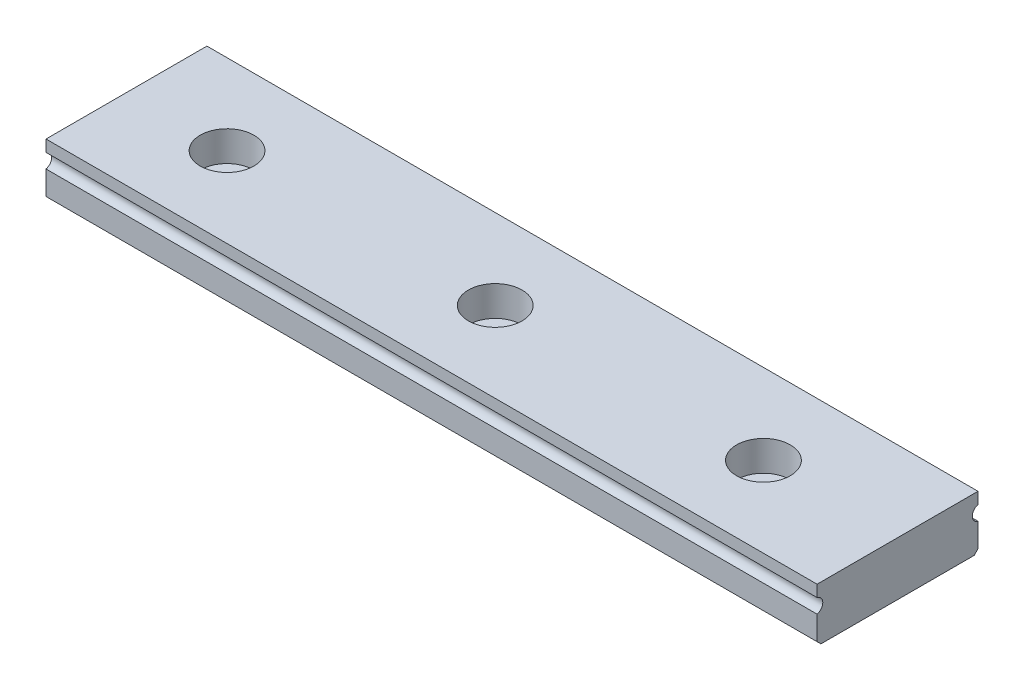
ISO-10303-21;
HEADER;
FILE_DESCRIPTION(('STEP AP214'),'2;1');
FILE_NAME('part.step','',(''),(''),'','','');
FILE_SCHEMA(('AUTOMOTIVE_DESIGN { 1 0 10303 214 1 1 1 1 }'));
ENDSEC;
DATA;
#1=APPLICATION_CONTEXT('core data for automotive mechanical design processes');
#2=APPLICATION_PROTOCOL_DEFINITION('international standard','automotive_design',2000,#1);
#3=PRODUCT_CONTEXT('',#1,'mechanical');
#4=PRODUCT('Part','Part','',(#3));
#5=PRODUCT_RELATED_PRODUCT_CATEGORY('part','',(#4));
#6=PRODUCT_DEFINITION_FORMATION('','',#4);
#7=PRODUCT_DEFINITION_CONTEXT('part definition',#1,'design');
#8=PRODUCT_DEFINITION('design','',#6,#7);
#9=PRODUCT_DEFINITION_SHAPE('','',#8);
#10=(LENGTH_UNIT() NAMED_UNIT(*) SI_UNIT(.MILLI.,.METRE.));
#11=(NAMED_UNIT(*) PLANE_ANGLE_UNIT() SI_UNIT($,.RADIAN.));
#12=(NAMED_UNIT(*) SI_UNIT($,.STERADIAN.) SOLID_ANGLE_UNIT());
#13=UNCERTAINTY_MEASURE_WITH_UNIT(LENGTH_MEASURE(1.E-05),#10,'distance_accuracy_value','');
#14=(GEOMETRIC_REPRESENTATION_CONTEXT(3) GLOBAL_UNCERTAINTY_ASSIGNED_CONTEXT((#13)) GLOBAL_UNIT_ASSIGNED_CONTEXT((#10,
#11,#12)) REPRESENTATION_CONTEXT('',''));
#15=CARTESIAN_POINT('',(0.,0.,0.));
#16=DIRECTION('',(0.,0.,1.));
#17=DIRECTION('',(1.,0.,0.));
#18=AXIS2_PLACEMENT_3D('',#15,#16,#17);
#19=CARTESIAN_POINT('',(0.,-3.,11.43));
#20=DIRECTION('',(0.,-0.707106781186547,0.707106781186548));
#21=DIRECTION('',(0.,-0.707106781186548,-0.707106781186547));
#22=AXIS2_PLACEMENT_3D('',#19,#20,#21);
#23=PLANE('',#22);
#24=DIRECTION('',(0.,-0.707106781186548,-0.707106781186547));
#25=VECTOR('',#24,1.);
#26=CARTESIAN_POINT('',(0.,-3.,11.43));
#27=LINE('',#26,#25);
#28=CARTESIAN_POINT('',(0.,-2.42999999999999,12.));
#29=VERTEX_POINT('',#28);
#30=CARTESIAN_POINT('',(0.,-3.,11.43));
#31=VERTEX_POINT('',#30);
#32=EDGE_CURVE('E186',#29,#31,#27,.T.);
#33=ORIENTED_EDGE('',*,*,#32,.T.);
#34=DIRECTION('',(1.,0.,0.));
#35=VECTOR('',#34,1.);
#36=CARTESIAN_POINT('',(0.,-3.,11.43));
#37=LINE('',#36,#35);
#38=CARTESIAN_POINT('',(115.,-3.,11.43));
#39=VERTEX_POINT('',#38);
#40=EDGE_CURVE('E176',#39,#31,#37,.F.);
#41=ORIENTED_EDGE('',*,*,#40,.F.);
#42=DIRECTION('',(0.,-0.707106781186548,-0.707106781186547));
#43=VECTOR('',#42,1.);
#44=CARTESIAN_POINT('',(115.,-3.,11.43));
#45=LINE('',#44,#43);
#46=CARTESIAN_POINT('',(115.,-2.42999999999999,12.));
#47=VERTEX_POINT('',#46);
#48=EDGE_CURVE('E193',#39,#47,#45,.F.);
#49=ORIENTED_EDGE('',*,*,#48,.T.);
#50=DIRECTION('',(1.,0.,0.));
#51=VECTOR('',#50,1.);
#52=CARTESIAN_POINT('',(0.,-2.43,12.));
#53=LINE('',#52,#51);
#54=EDGE_CURVE('E173',#29,#47,#53,.T.);
#55=ORIENTED_EDGE('',*,*,#54,.F.);
#56=EDGE_LOOP('',(#33,#41,#49,#55));
#57=FACE_BOUND('',#56,.T.);
#58=ADVANCED_FACE('F16',(#57),#23,.T.);
#59=CARTESIAN_POINT('',(0.,-2.43,-12.));
#60=DIRECTION('',(0.,-0.707106781186548,-0.707106781186547));
#61=DIRECTION('',(0.,0.707106781186547,-0.707106781186548));
#62=AXIS2_PLACEMENT_3D('',#59,#60,#61);
#63=PLANE('',#62);
#64=DIRECTION('',(0.,0.707106781186547,-0.707106781186548));
#65=VECTOR('',#64,1.);
#66=CARTESIAN_POINT('',(0.,-2.43,-12.));
#67=LINE('',#66,#65);
#68=CARTESIAN_POINT('',(0.,-3.,-11.43));
#69=VERTEX_POINT('',#68);
#70=CARTESIAN_POINT('',(0.,-2.43,-12.));
#71=VERTEX_POINT('',#70);
#72=EDGE_CURVE('E185',#69,#71,#67,.T.);
#73=ORIENTED_EDGE('',*,*,#72,.T.);
#74=DIRECTION('',(-1.,0.,0.));
#75=VECTOR('',#74,1.);
#76=CARTESIAN_POINT('',(0.,-2.43,-12.));
#77=LINE('',#76,#75);
#78=CARTESIAN_POINT('',(115.,-2.43,-12.));
#79=VERTEX_POINT('',#78);
#80=EDGE_CURVE('E110',#79,#71,#77,.T.);
#81=ORIENTED_EDGE('',*,*,#80,.F.);
#82=DIRECTION('',(0.,0.707106781186547,-0.707106781186548));
#83=VECTOR('',#82,1.);
#84=CARTESIAN_POINT('',(115.,-2.43,-12.));
#85=LINE('',#84,#83);
#86=CARTESIAN_POINT('',(115.,-3.,-11.43));
#87=VERTEX_POINT('',#86);
#88=EDGE_CURVE('E114',#79,#87,#85,.F.);
#89=ORIENTED_EDGE('',*,*,#88,.T.);
#90=DIRECTION('',(1.,0.,0.));
#91=VECTOR('',#90,1.);
#92=CARTESIAN_POINT('',(0.,-3.,-11.43));
#93=LINE('',#92,#91);
#94=EDGE_CURVE('E199',#69,#87,#93,.T.);
#95=ORIENTED_EDGE('',*,*,#94,.F.);
#96=EDGE_LOOP('',(#73,#81,#89,#95));
#97=FACE_BOUND('',#96,.T.);
#98=ADVANCED_FACE('F252',(#97),#63,.T.);
#99=CARTESIAN_POINT('',(15.,-1.25,0.));
#100=DIRECTION('',(0.,-1.,0.));
#101=DIRECTION('',(0.,0.,-1.));
#102=AXIS2_PLACEMENT_3D('',#99,#100,#101);
#103=CYLINDRICAL_SURFACE('',#102,2.25);
#104=CARTESIAN_POINT('',(15.,-3.,0.));
#105=DIRECTION('',(0.,-1.,0.));
#106=DIRECTION('',(0.,0.,-1.));
#107=AXIS2_PLACEMENT_3D('',#104,#105,#106);
#108=CIRCLE('',#107,2.25);
#109=CARTESIAN_POINT('',(15.,-3.,-2.25));
#110=VERTEX_POINT('',#109);
#111=EDGE_CURVE('E202',#110,#110,#108,.F.);
#112=ORIENTED_EDGE('',*,*,#111,.F.);
#113=EDGE_LOOP('',(#112));
#114=FACE_BOUND('',#113,.T.);
#115=CARTESIAN_POINT('',(15.,0.5,0.));
#116=DIRECTION('',(0.,-1.,0.));
#117=DIRECTION('',(0.,0.,-1.));
#118=AXIS2_PLACEMENT_3D('',#115,#116,#117);
#119=CIRCLE('',#118,2.25);
#120=CARTESIAN_POINT('',(15.,0.5,-2.25));
#121=VERTEX_POINT('',#120);
#122=EDGE_CURVE('E180',#121,#121,#119,.F.);
#123=ORIENTED_EDGE('',*,*,#122,.T.);
#124=EDGE_LOOP('',(#123));
#125=FACE_BOUND('',#124,.T.);
#126=ADVANCED_FACE('F248',(#114,#125),#103,.F.);
#127=CARTESIAN_POINT('',(95.,-1.25,0.));
#128=DIRECTION('',(0.,-1.,0.));
#129=DIRECTION('',(0.,0.,-1.));
#130=AXIS2_PLACEMENT_3D('',#127,#128,#129);
#131=CYLINDRICAL_SURFACE('',#130,2.25);
#132=CARTESIAN_POINT('',(95.,-3.,0.));
#133=DIRECTION('',(0.,-1.,0.));
#134=DIRECTION('',(0.,0.,-1.));
#135=AXIS2_PLACEMENT_3D('',#132,#133,#134);
#136=CIRCLE('',#135,2.25);
#137=CARTESIAN_POINT('',(95.,-3.,-2.25));
#138=VERTEX_POINT('',#137);
#139=EDGE_CURVE('E240',#138,#138,#136,.F.);
#140=ORIENTED_EDGE('',*,*,#139,.F.);
#141=EDGE_LOOP('',(#140));
#142=FACE_BOUND('',#141,.T.);
#143=CARTESIAN_POINT('',(95.,0.5,0.));
#144=DIRECTION('',(0.,-1.,0.));
#145=DIRECTION('',(0.,0.,-1.));
#146=AXIS2_PLACEMENT_3D('',#143,#144,#145);
#147=CIRCLE('',#146,2.25);
#148=CARTESIAN_POINT('',(95.,0.5,-2.25));
#149=VERTEX_POINT('',#148);
#150=EDGE_CURVE('E233',#149,#149,#147,.F.);
#151=ORIENTED_EDGE('',*,*,#150,.T.);
#152=EDGE_LOOP('',(#151));
#153=FACE_BOUND('',#152,.T.);
#154=ADVANCED_FACE('F251',(#142,#153),#131,.F.);
#155=CARTESIAN_POINT('',(55.,-1.25,0.));
#156=DIRECTION('',(0.,-1.,0.));
#157=DIRECTION('',(0.,0.,-1.));
#158=AXIS2_PLACEMENT_3D('',#155,#156,#157);
#159=CYLINDRICAL_SURFACE('',#158,2.25);
#160=CARTESIAN_POINT('',(55.,-3.,0.));
#161=DIRECTION('',(0.,-1.,0.));
#162=DIRECTION('',(0.,0.,-1.));
#163=AXIS2_PLACEMENT_3D('',#160,#161,#162);
#164=CIRCLE('',#163,2.25);
#165=CARTESIAN_POINT('',(55.,-3.,-2.25));
#166=VERTEX_POINT('',#165);
#167=EDGE_CURVE('E170',#166,#166,#164,.F.);
#168=ORIENTED_EDGE('',*,*,#167,.F.);
#169=EDGE_LOOP('',(#168));
#170=FACE_BOUND('',#169,.T.);
#171=CARTESIAN_POINT('',(55.,0.5,0.));
#172=DIRECTION('',(0.,-1.,0.));
#173=DIRECTION('',(0.,0.,-1.));
#174=AXIS2_PLACEMENT_3D('',#171,#172,#173);
#175=CIRCLE('',#174,2.25);
#176=CARTESIAN_POINT('',(55.,0.5,-2.25));
#177=VERTEX_POINT('',#176);
#178=EDGE_CURVE('E129',#177,#177,#175,.F.);
#179=ORIENTED_EDGE('',*,*,#178,.T.);
#180=EDGE_LOOP('',(#179));
#181=FACE_BOUND('',#180,.T.);
#182=ADVANCED_FACE('F313',(#170,#181),#159,.F.);
#183=CARTESIAN_POINT('',(0.,2.2,-12.25));
#184=DIRECTION('',(-1.,0.,0.));
#185=DIRECTION('',(0.,0.,1.));
#186=AXIS2_PLACEMENT_3D('',#183,#184,#185);
#187=CYLINDRICAL_SURFACE('',#186,1.1);
#188=CARTESIAN_POINT('',(115.,2.2,-12.25));
#189=DIRECTION('',(-1.,0.,0.));
#190=DIRECTION('',(0.,0.,1.));
#191=AXIS2_PLACEMENT_3D('',#188,#189,#190);
#192=CIRCLE('',#191,1.1);
#193=CARTESIAN_POINT('',(115.,3.27121426428143,-12.));
#194=VERTEX_POINT('',#193);
#195=CARTESIAN_POINT('',(115.,1.12878573571857,-12.));
#196=VERTEX_POINT('',#195);
#197=EDGE_CURVE('E90',#194,#196,#192,.F.);
#198=ORIENTED_EDGE('',*,*,#197,.T.);
#199=DIRECTION('',(-1.,0.,0.));
#200=VECTOR('',#199,1.);
#201=CARTESIAN_POINT('',(0.,1.12878573571857,-12.));
#202=LINE('',#201,#200);
#203=CARTESIAN_POINT('',(0.,1.12878573571857,-12.));
#204=VERTEX_POINT('',#203);
#205=EDGE_CURVE('E93',#204,#196,#202,.F.);
#206=ORIENTED_EDGE('',*,*,#205,.F.);
#207=CARTESIAN_POINT('',(0.,2.2,-12.25));
#208=DIRECTION('',(-1.,0.,0.));
#209=DIRECTION('',(0.,0.,1.));
#210=AXIS2_PLACEMENT_3D('',#207,#208,#209);
#211=CIRCLE('',#210,1.1);
#212=CARTESIAN_POINT('',(0.,3.27121426428143,-12.));
#213=VERTEX_POINT('',#212);
#214=EDGE_CURVE('E19',#213,#204,#211,.F.);
#215=ORIENTED_EDGE('',*,*,#214,.F.);
#216=DIRECTION('',(-1.,0.,0.));
#217=VECTOR('',#216,1.);
#218=CARTESIAN_POINT('',(0.,3.27121426428143,-12.));
#219=LINE('',#218,#217);
#220=EDGE_CURVE('E96',#194,#213,#219,.T.);
#221=ORIENTED_EDGE('',*,*,#220,.F.);
#222=EDGE_LOOP('',(#198,#206,#215,#221));
#223=FACE_BOUND('',#222,.T.);
#224=ADVANCED_FACE('F92',(#223),#187,.F.);
#225=CARTESIAN_POINT('',(0.,-2.43,12.));
#226=DIRECTION('',(0.,0.,1.));
#227=DIRECTION('',(1.,0.,0.));
#228=AXIS2_PLACEMENT_3D('',#225,#226,#227);
#229=PLANE('',#228);
#230=DIRECTION('',(0.,1.,0.));
#231=VECTOR('',#230,1.);
#232=CARTESIAN_POINT('',(0.,-3.,12.));
#233=LINE('',#232,#231);
#234=CARTESIAN_POINT('',(0.,1.12878573571857,12.));
#235=VERTEX_POINT('',#234);
#236=EDGE_CURVE('E208',#235,#29,#233,.F.);
#237=ORIENTED_EDGE('',*,*,#236,.T.);
#238=ORIENTED_EDGE('',*,*,#54,.T.);
#239=DIRECTION('',(0.,1.,0.));
#240=VECTOR('',#239,1.);
#241=CARTESIAN_POINT('',(115.,-3.00010307764064,12.0000000000001));
#242=LINE('',#241,#240);
#243=CARTESIAN_POINT('',(115.,1.12878573571856,12.0000000000001));
#244=VERTEX_POINT('',#243);
#245=EDGE_CURVE('E127',#47,#244,#242,.T.);
#246=ORIENTED_EDGE('',*,*,#245,.T.);
#247=DIRECTION('',(-1.,0.,0.));
#248=VECTOR('',#247,1.);
#249=CARTESIAN_POINT('',(0.,1.12878573571856,12.0000000000001));
#250=LINE('',#249,#248);
#251=EDGE_CURVE('E109',#244,#235,#250,.T.);
#252=ORIENTED_EDGE('',*,*,#251,.T.);
#253=EDGE_LOOP('',(#237,#238,#246,#252));
#254=FACE_BOUND('',#253,.T.);
#255=ADVANCED_FACE('F321',(#254),#229,.T.);
#256=CARTESIAN_POINT('',(0.,-3.,-11.43));
#257=DIRECTION('',(0.,-1.,0.));
#258=DIRECTION('',(0.,0.,-1.));
#259=AXIS2_PLACEMENT_3D('',#256,#257,#258);
#260=PLANE('',#259);
#261=ORIENTED_EDGE('',*,*,#167,.T.);
#262=EDGE_LOOP('',(#261));
#263=FACE_BOUND('',#262,.T.);
#264=ORIENTED_EDGE('',*,*,#139,.T.);
#265=EDGE_LOOP('',(#264));
#266=FACE_BOUND('',#265,.T.);
#267=ORIENTED_EDGE('',*,*,#111,.T.);
#268=EDGE_LOOP('',(#267));
#269=FACE_BOUND('',#268,.T.);
#270=DIRECTION('',(0.,0.,-1.));
#271=VECTOR('',#270,1.);
#272=CARTESIAN_POINT('',(0.,-3.,0.));
#273=LINE('',#272,#271);
#274=EDGE_CURVE('E205',#31,#69,#273,.T.);
#275=ORIENTED_EDGE('',*,*,#274,.T.);
#276=ORIENTED_EDGE('',*,*,#94,.T.);
#277=DIRECTION('',(0.,0.,1.));
#278=VECTOR('',#277,1.);
#279=CARTESIAN_POINT('',(115.,-3.,12.0000000000001));
#280=LINE('',#279,#278);
#281=EDGE_CURVE('E116',#87,#39,#280,.T.);
#282=ORIENTED_EDGE('',*,*,#281,.T.);
#283=ORIENTED_EDGE('',*,*,#40,.T.);
#284=EDGE_LOOP('',(#275,#276,#282,#283));
#285=FACE_BOUND('',#284,.T.);
#286=ADVANCED_FACE('F245',(#263,#266,#269,#285),#260,.T.);
#287=CARTESIAN_POINT('',(0.,1.12878573571857,-12.));
#288=DIRECTION('',(0.,0.,-1.));
#289=DIRECTION('',(-1.,0.,0.));
#290=AXIS2_PLACEMENT_3D('',#287,#288,#289);
#291=PLANE('',#290);
#292=DIRECTION('',(0.,1.,0.));
#293=VECTOR('',#292,1.);
#294=CARTESIAN_POINT('',(0.,-3.,-12.));
#295=LINE('',#294,#293);
#296=EDGE_CURVE('E108',#71,#204,#295,.T.);
#297=ORIENTED_EDGE('',*,*,#296,.T.);
#298=ORIENTED_EDGE('',*,*,#205,.T.);
#299=DIRECTION('',(0.,1.,0.));
#300=VECTOR('',#299,1.);
#301=CARTESIAN_POINT('',(115.,-3.00010307764064,-12.));
#302=LINE('',#301,#300);
#303=EDGE_CURVE('E100',#196,#79,#302,.F.);
#304=ORIENTED_EDGE('',*,*,#303,.T.);
#305=ORIENTED_EDGE('',*,*,#80,.T.);
#306=EDGE_LOOP('',(#297,#298,#304,#305));
#307=FACE_BOUND('',#306,.T.);
#308=ADVANCED_FACE('F105',(#307),#291,.T.);
#309=CARTESIAN_POINT('',(0.,2.2,12.25));
#310=DIRECTION('',(-1.,0.,0.));
#311=DIRECTION('',(0.,0.,1.));
#312=AXIS2_PLACEMENT_3D('',#309,#310,#311);
#313=CYLINDRICAL_SURFACE('',#312,1.1);
#314=CARTESIAN_POINT('',(115.,2.2,12.25));
#315=DIRECTION('',(-1.,0.,0.));
#316=DIRECTION('',(0.,0.,1.));
#317=AXIS2_PLACEMENT_3D('',#314,#315,#316);
#318=CIRCLE('',#317,1.1);
#319=CARTESIAN_POINT('',(115.,3.27121426428143,12.));
#320=VERTEX_POINT('',#319);
#321=EDGE_CURVE('E101',#244,#320,#318,.F.);
#322=ORIENTED_EDGE('',*,*,#321,.T.);
#323=DIRECTION('',(1.,0.,0.));
#324=VECTOR('',#323,1.);
#325=CARTESIAN_POINT('',(0.,3.27121426428143,12.));
#326=LINE('',#325,#324);
#327=CARTESIAN_POINT('',(0.,3.27121426428143,12.));
#328=VERTEX_POINT('',#327);
#329=EDGE_CURVE('E132',#328,#320,#326,.T.);
#330=ORIENTED_EDGE('',*,*,#329,.F.);
#331=CARTESIAN_POINT('',(0.,2.2,12.25));
#332=DIRECTION('',(-1.,0.,0.));
#333=DIRECTION('',(0.,0.,1.));
#334=AXIS2_PLACEMENT_3D('',#331,#332,#333);
#335=CIRCLE('',#334,1.1);
#336=EDGE_CURVE('E164',#328,#235,#335,.T.);
#337=ORIENTED_EDGE('',*,*,#336,.T.);
#338=ORIENTED_EDGE('',*,*,#251,.F.);
#339=EDGE_LOOP('',(#322,#330,#337,#338));
#340=FACE_BOUND('',#339,.T.);
#341=ADVANCED_FACE('F259',(#340),#313,.F.);
#342=CARTESIAN_POINT('',(18.125,0.5,0.));
#343=DIRECTION('',(0.,-1.,0.));
#344=DIRECTION('',(0.,0.,-1.));
#345=AXIS2_PLACEMENT_3D('',#342,#343,#344);
#346=PLANE('',#345);
#347=CARTESIAN_POINT('',(15.,0.5,0.));
#348=DIRECTION('',(0.,-1.,0.));
#349=DIRECTION('',(0.,0.,-1.));
#350=AXIS2_PLACEMENT_3D('',#347,#348,#349);
#351=CIRCLE('',#350,4.);
#352=CARTESIAN_POINT('',(15.,0.5,-4.));
#353=VERTEX_POINT('',#352);
#354=EDGE_CURVE('E135',#353,#353,#351,.F.);
#355=ORIENTED_EDGE('',*,*,#354,.T.);
#356=EDGE_LOOP('',(#355));
#357=FACE_BOUND('',#356,.T.);
#358=ORIENTED_EDGE('',*,*,#122,.F.);
#359=EDGE_LOOP('',(#358));
#360=FACE_BOUND('',#359,.T.);
#361=ADVANCED_FACE('F256',(#357,#360),#346,.F.);
#362=CARTESIAN_POINT('',(98.125,0.5,0.));
#363=DIRECTION('',(0.,-1.,0.));
#364=DIRECTION('',(0.,0.,-1.));
#365=AXIS2_PLACEMENT_3D('',#362,#363,#364);
#366=PLANE('',#365);
#367=CARTESIAN_POINT('',(95.,0.5,0.));
#368=DIRECTION('',(0.,-1.,0.));
#369=DIRECTION('',(0.,0.,-1.));
#370=AXIS2_PLACEMENT_3D('',#367,#368,#369);
#371=CIRCLE('',#370,4.);
#372=CARTESIAN_POINT('',(95.,0.5,-4.));
#373=VERTEX_POINT('',#372);
#374=EDGE_CURVE('E223',#373,#373,#371,.F.);
#375=ORIENTED_EDGE('',*,*,#374,.T.);
#376=EDGE_LOOP('',(#375));
#377=FACE_BOUND('',#376,.T.);
#378=ORIENTED_EDGE('',*,*,#150,.F.);
#379=EDGE_LOOP('',(#378));
#380=FACE_BOUND('',#379,.T.);
#381=ADVANCED_FACE('F258',(#377,#380),#366,.F.);
#382=CARTESIAN_POINT('',(58.125,0.5,0.));
#383=DIRECTION('',(0.,-1.,0.));
#384=DIRECTION('',(0.,0.,-1.));
#385=AXIS2_PLACEMENT_3D('',#382,#383,#384);
#386=PLANE('',#385);
#387=CARTESIAN_POINT('',(55.,0.5,0.));
#388=DIRECTION('',(0.,-1.,0.));
#389=DIRECTION('',(0.,0.,-1.));
#390=AXIS2_PLACEMENT_3D('',#387,#388,#389);
#391=CIRCLE('',#390,4.);
#392=CARTESIAN_POINT('',(55.,0.5,-4.));
#393=VERTEX_POINT('',#392);
#394=EDGE_CURVE('E160',#393,#393,#391,.F.);
#395=ORIENTED_EDGE('',*,*,#394,.T.);
#396=EDGE_LOOP('',(#395));
#397=FACE_BOUND('',#396,.T.);
#398=ORIENTED_EDGE('',*,*,#178,.F.);
#399=EDGE_LOOP('',(#398));
#400=FACE_BOUND('',#399,.T.);
#401=ADVANCED_FACE('F267',(#397,#400),#386,.F.);
#402=CARTESIAN_POINT('',(115.,-3.00010307764064,12.0000000000001));
#403=DIRECTION('',(-1.,0.,0.));
#404=DIRECTION('',(0.,0.,1.));
#405=AXIS2_PLACEMENT_3D('',#402,#403,#404);
#406=PLANE('',#405);
#407=ORIENTED_EDGE('',*,*,#281,.F.);
#408=ORIENTED_EDGE('',*,*,#88,.F.);
#409=ORIENTED_EDGE('',*,*,#303,.F.);
#410=ORIENTED_EDGE('',*,*,#197,.F.);
#411=DIRECTION('',(0.,1.,0.));
#412=VECTOR('',#411,1.);
#413=CARTESIAN_POINT('',(115.,5.,-12.));
#414=LINE('',#413,#412);
#415=CARTESIAN_POINT('',(115.,5.,-12.));
#416=VERTEX_POINT('',#415);
#417=EDGE_CURVE('E119',#416,#194,#414,.F.);
#418=ORIENTED_EDGE('',*,*,#417,.F.);
#419=DIRECTION('',(0.,0.,1.));
#420=VECTOR('',#419,1.);
#421=CARTESIAN_POINT('',(115.,5.,12.));
#422=LINE('',#421,#420);
#423=CARTESIAN_POINT('',(115.,5.,12.));
#424=VERTEX_POINT('',#423);
#425=EDGE_CURVE('E157',#424,#416,#422,.F.);
#426=ORIENTED_EDGE('',*,*,#425,.F.);
#427=DIRECTION('',(0.,1.,0.));
#428=VECTOR('',#427,1.);
#429=CARTESIAN_POINT('',(115.,3.27121426428143,12.));
#430=LINE('',#429,#428);
#431=EDGE_CURVE('E137',#320,#424,#430,.T.);
#432=ORIENTED_EDGE('',*,*,#431,.F.);
#433=ORIENTED_EDGE('',*,*,#321,.F.);
#434=ORIENTED_EDGE('',*,*,#245,.F.);
#435=ORIENTED_EDGE('',*,*,#48,.F.);
#436=EDGE_LOOP('',(#407,#408,#409,#410,#418,#426,#432,#433,#434,#435));
#437=FACE_BOUND('',#436,.T.);
#438=ADVANCED_FACE('F113',(#437),#406,.F.);
#439=CARTESIAN_POINT('',(0.,5.,-12.));
#440=DIRECTION('',(0.,0.,-1.));
#441=DIRECTION('',(-1.,0.,0.));
#442=AXIS2_PLACEMENT_3D('',#439,#440,#441);
#443=PLANE('',#442);
#444=DIRECTION('',(0.,1.,0.));
#445=VECTOR('',#444,1.);
#446=CARTESIAN_POINT('',(0.,-3.,-12.));
#447=LINE('',#446,#445);
#448=CARTESIAN_POINT('',(0.,5.,-12.));
#449=VERTEX_POINT('',#448);
#450=EDGE_CURVE('E154',#213,#449,#447,.T.);
#451=ORIENTED_EDGE('',*,*,#450,.T.);
#452=DIRECTION('',(1.,0.,0.));
#453=VECTOR('',#452,1.);
#454=CARTESIAN_POINT('',(0.,5.,-12.));
#455=LINE('',#454,#453);
#456=EDGE_CURVE('E149',#416,#449,#455,.F.);
#457=ORIENTED_EDGE('',*,*,#456,.F.);
#458=ORIENTED_EDGE('',*,*,#417,.T.);
#459=ORIENTED_EDGE('',*,*,#220,.T.);
#460=EDGE_LOOP('',(#451,#457,#458,#459));
#461=FACE_BOUND('',#460,.T.);
#462=ADVANCED_FACE('F299',(#461),#443,.T.);
#463=CARTESIAN_POINT('',(0.,-3.,0.));
#464=DIRECTION('',(1.,0.,0.));
#465=DIRECTION('',(0.,0.,-1.));
#466=AXIS2_PLACEMENT_3D('',#463,#464,#465);
#467=PLANE('',#466);
#468=ORIENTED_EDGE('',*,*,#450,.F.);
#469=ORIENTED_EDGE('',*,*,#214,.T.);
#470=ORIENTED_EDGE('',*,*,#296,.F.);
#471=ORIENTED_EDGE('',*,*,#72,.F.);
#472=ORIENTED_EDGE('',*,*,#274,.F.);
#473=ORIENTED_EDGE('',*,*,#32,.F.);
#474=ORIENTED_EDGE('',*,*,#236,.F.);
#475=ORIENTED_EDGE('',*,*,#336,.F.);
#476=DIRECTION('',(0.,1.,0.));
#477=VECTOR('',#476,1.);
#478=CARTESIAN_POINT('',(0.,3.27121426428143,12.));
#479=LINE('',#478,#477);
#480=CARTESIAN_POINT('',(0.,5.,12.));
#481=VERTEX_POINT('',#480);
#482=EDGE_CURVE('E34',#481,#328,#479,.F.);
#483=ORIENTED_EDGE('',*,*,#482,.F.);
#484=DIRECTION('',(0.,0.,1.));
#485=VECTOR('',#484,1.);
#486=CARTESIAN_POINT('',(0.,5.,12.));
#487=LINE('',#486,#485);
#488=EDGE_CURVE('E144',#449,#481,#487,.T.);
#489=ORIENTED_EDGE('',*,*,#488,.F.);
#490=EDGE_LOOP('',(#468,#469,#470,#471,#472,#473,#474,#475,#483,#489));
#491=FACE_BOUND('',#490,.T.);
#492=ADVANCED_FACE('F295',(#491),#467,.F.);
#493=CARTESIAN_POINT('',(0.,3.27121426428143,12.));
#494=DIRECTION('',(0.,0.,1.));
#495=DIRECTION('',(1.,0.,0.));
#496=AXIS2_PLACEMENT_3D('',#493,#494,#495);
#497=PLANE('',#496);
#498=ORIENTED_EDGE('',*,*,#482,.T.);
#499=ORIENTED_EDGE('',*,*,#329,.T.);
#500=ORIENTED_EDGE('',*,*,#431,.T.);
#501=DIRECTION('',(1.,0.,0.));
#502=VECTOR('',#501,1.);
#503=CARTESIAN_POINT('',(0.,5.,12.));
#504=LINE('',#503,#502);
#505=EDGE_CURVE('E140',#481,#424,#504,.T.);
#506=ORIENTED_EDGE('',*,*,#505,.F.);
#507=EDGE_LOOP('',(#498,#499,#500,#506));
#508=FACE_BOUND('',#507,.T.);
#509=ADVANCED_FACE('F291',(#508),#497,.T.);
#510=CARTESIAN_POINT('',(15.,2.75,0.));
#511=DIRECTION('',(0.,-1.,0.));
#512=DIRECTION('',(0.,0.,-1.));
#513=AXIS2_PLACEMENT_3D('',#510,#511,#512);
#514=CYLINDRICAL_SURFACE('',#513,4.);
#515=ORIENTED_EDGE('',*,*,#354,.F.);
#516=EDGE_LOOP('',(#515));
#517=FACE_BOUND('',#516,.T.);
#518=CARTESIAN_POINT('',(15.,5.,0.));
#519=DIRECTION('',(0.,-1.,0.));
#520=DIRECTION('',(0.,0.,-1.));
#521=AXIS2_PLACEMENT_3D('',#518,#519,#520);
#522=CIRCLE('',#521,4.);
#523=CARTESIAN_POINT('',(15.,5.,-4.));
#524=VERTEX_POINT('',#523);
#525=EDGE_CURVE('E143',#524,#524,#522,.T.);
#526=ORIENTED_EDGE('',*,*,#525,.F.);
#527=EDGE_LOOP('',(#526));
#528=FACE_BOUND('',#527,.T.);
#529=ADVANCED_FACE('F287',(#517,#528),#514,.F.);
#530=CARTESIAN_POINT('',(95.,2.75,0.));
#531=DIRECTION('',(0.,-1.,0.));
#532=DIRECTION('',(0.,0.,-1.));
#533=AXIS2_PLACEMENT_3D('',#530,#531,#532);
#534=CYLINDRICAL_SURFACE('',#533,4.);
#535=ORIENTED_EDGE('',*,*,#374,.F.);
#536=EDGE_LOOP('',(#535));
#537=FACE_BOUND('',#536,.T.);
#538=CARTESIAN_POINT('',(95.,5.,0.));
#539=DIRECTION('',(0.,-1.,0.));
#540=DIRECTION('',(0.,0.,-1.));
#541=AXIS2_PLACEMENT_3D('',#538,#539,#540);
#542=CIRCLE('',#541,4.);
#543=CARTESIAN_POINT('',(95.,5.,-4.));
#544=VERTEX_POINT('',#543);
#545=EDGE_CURVE('E25',#544,#544,#542,.T.);
#546=ORIENTED_EDGE('',*,*,#545,.F.);
#547=EDGE_LOOP('',(#546));
#548=FACE_BOUND('',#547,.T.);
#549=ADVANCED_FACE('F280',(#537,#548),#534,.F.);
#550=CARTESIAN_POINT('',(55.,2.75,0.));
#551=DIRECTION('',(0.,-1.,0.));
#552=DIRECTION('',(0.,0.,-1.));
#553=AXIS2_PLACEMENT_3D('',#550,#551,#552);
#554=CYLINDRICAL_SURFACE('',#553,4.);
#555=ORIENTED_EDGE('',*,*,#394,.F.);
#556=EDGE_LOOP('',(#555));
#557=FACE_BOUND('',#556,.T.);
#558=CARTESIAN_POINT('',(55.,5.,0.));
#559=DIRECTION('',(0.,-1.,0.));
#560=DIRECTION('',(0.,0.,-1.));
#561=AXIS2_PLACEMENT_3D('',#558,#559,#560);
#562=CIRCLE('',#561,4.);
#563=CARTESIAN_POINT('',(55.,5.,-4.));
#564=VERTEX_POINT('',#563);
#565=EDGE_CURVE('E10',#564,#564,#562,.T.);
#566=ORIENTED_EDGE('',*,*,#565,.F.);
#567=EDGE_LOOP('',(#566));
#568=FACE_BOUND('',#567,.T.);
#569=ADVANCED_FACE('F274',(#557,#568),#554,.F.);
#570=CARTESIAN_POINT('',(0.,5.,12.));
#571=DIRECTION('',(0.,1.,0.));
#572=DIRECTION('',(0.,0.,1.));
#573=AXIS2_PLACEMENT_3D('',#570,#571,#572);
#574=PLANE('',#573);
#575=ORIENTED_EDGE('',*,*,#565,.T.);
#576=EDGE_LOOP('',(#575));
#577=FACE_BOUND('',#576,.T.);
#578=ORIENTED_EDGE('',*,*,#545,.T.);
#579=EDGE_LOOP('',(#578));
#580=FACE_BOUND('',#579,.T.);
#581=ORIENTED_EDGE('',*,*,#525,.T.);
#582=EDGE_LOOP('',(#581));
#583=FACE_BOUND('',#582,.T.);
#584=ORIENTED_EDGE('',*,*,#488,.T.);
#585=ORIENTED_EDGE('',*,*,#505,.T.);
#586=ORIENTED_EDGE('',*,*,#425,.T.);
#587=ORIENTED_EDGE('',*,*,#456,.T.);
#588=EDGE_LOOP('',(#584,#585,#586,#587));
#589=FACE_BOUND('',#588,.T.);
#590=ADVANCED_FACE('F272',(#577,#580,#583,#589),#574,.T.);
#591=CLOSED_SHELL('',(#58,#98,#126,#154,#182,#224,#255,#286,#308,#341,#361,#381,#401,#438,#462,
#492,#509,#529,#549,#569,#590));
#592=MANIFOLD_SOLID_BREP('B1',#591);
#593=ADVANCED_BREP_SHAPE_REPRESENTATION('',(#18,#592),#14);
#594=SHAPE_DEFINITION_REPRESENTATION(#9,#593);
ENDSEC;
END-ISO-10303-21;
